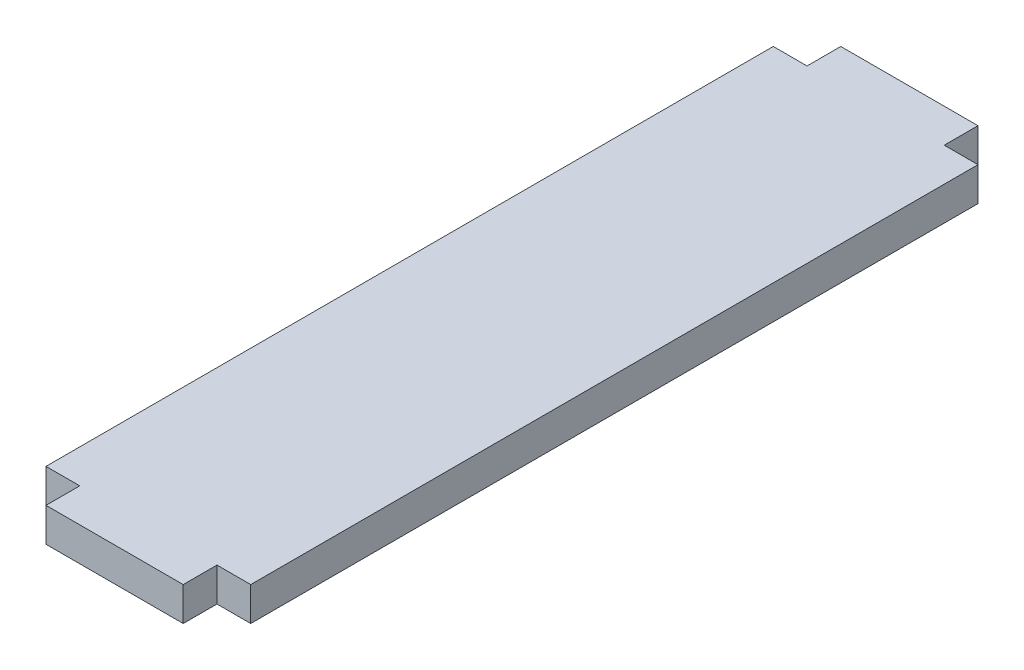
ISO-10303-21;
HEADER;
FILE_DESCRIPTION(('STEP AP214'),'2;1');
FILE_NAME('part.step','',(''),(''),'','','');
FILE_SCHEMA(('AUTOMOTIVE_DESIGN { 1 0 10303 214 1 1 1 1 }'));
ENDSEC;
DATA;
#1=APPLICATION_CONTEXT('core data for automotive mechanical design processes');
#2=APPLICATION_PROTOCOL_DEFINITION('international standard','automotive_design',2000,#1);
#3=PRODUCT_CONTEXT('',#1,'mechanical');
#4=PRODUCT('Part','Part','',(#3));
#5=PRODUCT_RELATED_PRODUCT_CATEGORY('part','',(#4));
#6=PRODUCT_DEFINITION_FORMATION('','',#4);
#7=PRODUCT_DEFINITION_CONTEXT('part definition',#1,'design');
#8=PRODUCT_DEFINITION('design','',#6,#7);
#9=PRODUCT_DEFINITION_SHAPE('','',#8);
#10=(LENGTH_UNIT() NAMED_UNIT(*) SI_UNIT(.MILLI.,.METRE.));
#11=(NAMED_UNIT(*) PLANE_ANGLE_UNIT() SI_UNIT($,.RADIAN.));
#12=(NAMED_UNIT(*) SI_UNIT($,.STERADIAN.) SOLID_ANGLE_UNIT());
#13=UNCERTAINTY_MEASURE_WITH_UNIT(LENGTH_MEASURE(1.E-05),#10,'distance_accuracy_value','');
#14=(GEOMETRIC_REPRESENTATION_CONTEXT(3) GLOBAL_UNCERTAINTY_ASSIGNED_CONTEXT((#13)) GLOBAL_UNIT_ASSIGNED_CONTEXT((#10,
#11,#12)) REPRESENTATION_CONTEXT('',''));
#15=CARTESIAN_POINT('',(0.,0.,0.));
#16=DIRECTION('',(0.,0.,1.));
#17=DIRECTION('',(1.,0.,0.));
#18=AXIS2_PLACEMENT_3D('',#15,#16,#17);
#19=CARTESIAN_POINT('',(-60.2742,3.1242,-61.5442));
#20=DIRECTION('',(0.,0.,-1.));
#21=DIRECTION('',(-1.,0.,0.));
#22=AXIS2_PLACEMENT_3D('',#19,#20,#21);
#23=PLANE('',#22);
#24=DIRECTION('',(1.,0.,0.));
#25=VECTOR('',#24,1.);
#26=CARTESIAN_POINT('',(-60.2742,0.,-61.5442));
#27=LINE('',#26,#25);
#28=CARTESIAN_POINT('',(-60.2742,0.,-61.5442));
#29=VERTEX_POINT('',#28);
#30=CARTESIAN_POINT('',(-57.15,0.,-61.5442));
#31=VERTEX_POINT('',#30);
#32=EDGE_CURVE('E153',#29,#31,#27,.T.);
#33=ORIENTED_EDGE('',*,*,#32,.T.);
#34=DIRECTION('',(0.,-1.,0.));
#35=VECTOR('',#34,1.);
#36=CARTESIAN_POINT('',(-57.15,3.1242,-61.5442));
#37=LINE('',#36,#35);
#38=CARTESIAN_POINT('',(-57.15,3.1242,-61.5442));
#39=VERTEX_POINT('',#38);
#40=EDGE_CURVE('E11',#39,#31,#37,.T.);
#41=ORIENTED_EDGE('',*,*,#40,.F.);
#42=DIRECTION('',(1.,0.,0.));
#43=VECTOR('',#42,1.);
#44=CARTESIAN_POINT('',(-60.2742,3.1242,-61.5442));
#45=LINE('',#44,#43);
#46=CARTESIAN_POINT('',(-60.2742,3.1242,-61.5442));
#47=VERTEX_POINT('',#46);
#48=EDGE_CURVE('E175',#47,#39,#45,.T.);
#49=ORIENTED_EDGE('',*,*,#48,.F.);
#50=DIRECTION('',(0.,-1.,0.));
#51=VECTOR('',#50,1.);
#52=CARTESIAN_POINT('',(-60.2742,3.1242,-61.5442));
#53=LINE('',#52,#51);
#54=EDGE_CURVE('E149',#47,#29,#53,.T.);
#55=ORIENTED_EDGE('',*,*,#54,.T.);
#56=EDGE_LOOP('',(#33,#41,#49,#55));
#57=FACE_BOUND('',#56,.T.);
#58=ADVANCED_FACE('F33',(#57),#23,.F.);
#59=CARTESIAN_POINT('',(-57.15,3.1242,-61.5442));
#60=DIRECTION('',(1.,0.,0.));
#61=DIRECTION('',(0.,0.,-1.));
#62=AXIS2_PLACEMENT_3D('',#59,#60,#61);
#63=PLANE('',#62);
#64=DIRECTION('',(0.,0.,1.));
#65=VECTOR('',#64,1.);
#66=CARTESIAN_POINT('',(-57.15,0.,-61.5442));
#67=LINE('',#66,#65);
#68=CARTESIAN_POINT('',(-57.15,0.,-58.42));
#69=VERTEX_POINT('',#68);
#70=EDGE_CURVE('E156',#31,#69,#67,.T.);
#71=ORIENTED_EDGE('',*,*,#70,.T.);
#72=DIRECTION('',(0.,-1.,0.));
#73=VECTOR('',#72,1.);
#74=CARTESIAN_POINT('',(-57.15,3.1242,-58.42));
#75=LINE('',#74,#73);
#76=CARTESIAN_POINT('',(-57.15,3.1242,-58.42));
#77=VERTEX_POINT('',#76);
#78=EDGE_CURVE('E41',#77,#69,#75,.T.);
#79=ORIENTED_EDGE('',*,*,#78,.F.);
#80=DIRECTION('',(0.,0.,1.));
#81=VECTOR('',#80,1.);
#82=CARTESIAN_POINT('',(-57.15,3.1242,-61.5442));
#83=LINE('',#82,#81);
#84=EDGE_CURVE('E104',#39,#77,#83,.T.);
#85=ORIENTED_EDGE('',*,*,#84,.F.);
#86=ORIENTED_EDGE('',*,*,#40,.T.);
#87=EDGE_LOOP('',(#71,#79,#85,#86));
#88=FACE_BOUND('',#87,.T.);
#89=ADVANCED_FACE('F253',(#88),#63,.F.);
#90=CARTESIAN_POINT('',(-57.15,3.1242,-58.42));
#91=DIRECTION('',(0.,0.,-1.));
#92=DIRECTION('',(-1.,0.,0.));
#93=AXIS2_PLACEMENT_3D('',#90,#91,#92);
#94=PLANE('',#93);
#95=DIRECTION('',(1.,0.,0.));
#96=VECTOR('',#95,1.);
#97=CARTESIAN_POINT('',(-57.15,0.,-58.42));
#98=LINE('',#97,#96);
#99=CARTESIAN_POINT('',(-44.45,0.,-58.42));
#100=VERTEX_POINT('',#99);
#101=EDGE_CURVE('E158',#69,#100,#98,.T.);
#102=ORIENTED_EDGE('',*,*,#101,.T.);
#103=DIRECTION('',(0.,-1.,0.));
#104=VECTOR('',#103,1.);
#105=CARTESIAN_POINT('',(-44.45,3.1242,-58.42));
#106=LINE('',#105,#104);
#107=CARTESIAN_POINT('',(-44.45,3.1242,-58.42));
#108=VERTEX_POINT('',#107);
#109=EDGE_CURVE('E194',#108,#100,#106,.T.);
#110=ORIENTED_EDGE('',*,*,#109,.F.);
#111=DIRECTION('',(1.,0.,0.));
#112=VECTOR('',#111,1.);
#113=CARTESIAN_POINT('',(-57.15,3.1242,-58.42));
#114=LINE('',#113,#112);
#115=EDGE_CURVE('E202',#77,#108,#114,.T.);
#116=ORIENTED_EDGE('',*,*,#115,.F.);
#117=ORIENTED_EDGE('',*,*,#78,.T.);
#118=EDGE_LOOP('',(#102,#110,#116,#117));
#119=FACE_BOUND('',#118,.T.);
#120=ADVANCED_FACE('F200',(#119),#94,.F.);
#121=CARTESIAN_POINT('',(-44.45,3.1242,-58.42));
#122=DIRECTION('',(-1.,0.,0.));
#123=DIRECTION('',(0.,0.,1.));
#124=AXIS2_PLACEMENT_3D('',#121,#122,#123);
#125=PLANE('',#124);
#126=DIRECTION('',(0.,0.,-1.));
#127=VECTOR('',#126,1.);
#128=CARTESIAN_POINT('',(-44.45,0.,-58.42));
#129=LINE('',#128,#127);
#130=CARTESIAN_POINT('',(-44.45,0.,-61.5442));
#131=VERTEX_POINT('',#130);
#132=EDGE_CURVE('E160',#100,#131,#129,.T.);
#133=ORIENTED_EDGE('',*,*,#132,.T.);
#134=DIRECTION('',(0.,-1.,0.));
#135=VECTOR('',#134,1.);
#136=CARTESIAN_POINT('',(-44.45,3.1242,-61.5442));
#137=LINE('',#136,#135);
#138=CARTESIAN_POINT('',(-44.45,3.1242,-61.5442));
#139=VERTEX_POINT('',#138);
#140=EDGE_CURVE('E191',#139,#131,#137,.T.);
#141=ORIENTED_EDGE('',*,*,#140,.F.);
#142=DIRECTION('',(0.,0.,-1.));
#143=VECTOR('',#142,1.);
#144=CARTESIAN_POINT('',(-44.45,3.1242,-58.42));
#145=LINE('',#144,#143);
#146=EDGE_CURVE('E220',#108,#139,#145,.T.);
#147=ORIENTED_EDGE('',*,*,#146,.F.);
#148=ORIENTED_EDGE('',*,*,#109,.T.);
#149=EDGE_LOOP('',(#133,#141,#147,#148));
#150=FACE_BOUND('',#149,.T.);
#151=ADVANCED_FACE('F211',(#150),#125,.F.);
#152=CARTESIAN_POINT('',(-44.45,3.1242,-61.5442));
#153=DIRECTION('',(0.,0.,-1.));
#154=DIRECTION('',(-1.,0.,0.));
#155=AXIS2_PLACEMENT_3D('',#152,#153,#154);
#156=PLANE('',#155);
#157=DIRECTION('',(1.,0.,0.));
#158=VECTOR('',#157,1.);
#159=CARTESIAN_POINT('',(-44.45,0.,-61.5442));
#160=LINE('',#159,#158);
#161=CARTESIAN_POINT('',(-41.3258000000001,0.,-61.5442));
#162=VERTEX_POINT('',#161);
#163=EDGE_CURVE('E162',#131,#162,#160,.T.);
#164=ORIENTED_EDGE('',*,*,#163,.T.);
#165=DIRECTION('',(0.,-1.,0.));
#166=VECTOR('',#165,1.);
#167=CARTESIAN_POINT('',(-41.3258000000001,3.1242,-61.5442));
#168=LINE('',#167,#166);
#169=CARTESIAN_POINT('',(-41.3258000000001,3.1242,-61.5442));
#170=VERTEX_POINT('',#169);
#171=EDGE_CURVE('E188',#170,#162,#168,.T.);
#172=ORIENTED_EDGE('',*,*,#171,.F.);
#173=DIRECTION('',(1.,0.,0.));
#174=VECTOR('',#173,1.);
#175=CARTESIAN_POINT('',(-44.45,3.1242,-61.5442));
#176=LINE('',#175,#174);
#177=EDGE_CURVE('E217',#139,#170,#176,.T.);
#178=ORIENTED_EDGE('',*,*,#177,.F.);
#179=ORIENTED_EDGE('',*,*,#140,.T.);
#180=EDGE_LOOP('',(#164,#172,#178,#179));
#181=FACE_BOUND('',#180,.T.);
#182=ADVANCED_FACE('F215',(#181),#156,.F.);
#183=CARTESIAN_POINT('',(-41.3258000000001,3.1242,-61.5442));
#184=DIRECTION('',(-1.,0.,0.));
#185=DIRECTION('',(0.,0.,1.));
#186=AXIS2_PLACEMENT_3D('',#183,#184,#185);
#187=PLANE('',#186);
#188=DIRECTION('',(0.,0.,-1.));
#189=VECTOR('',#188,1.);
#190=CARTESIAN_POINT('',(-41.3258000000001,0.,-61.5442));
#191=LINE('',#190,#189);
#192=CARTESIAN_POINT('',(-41.3258000000001,0.,-128.8542));
#193=VERTEX_POINT('',#192);
#194=EDGE_CURVE('E164',#162,#193,#191,.T.);
#195=ORIENTED_EDGE('',*,*,#194,.T.);
#196=DIRECTION('',(0.,-1.,0.));
#197=VECTOR('',#196,1.);
#198=CARTESIAN_POINT('',(-41.3258000000001,3.1242,-128.8542));
#199=LINE('',#198,#197);
#200=CARTESIAN_POINT('',(-41.3258000000001,3.1242,-128.8542));
#201=VERTEX_POINT('',#200);
#202=EDGE_CURVE('E185',#201,#193,#199,.T.);
#203=ORIENTED_EDGE('',*,*,#202,.F.);
#204=DIRECTION('',(0.,0.,-1.));
#205=VECTOR('',#204,1.);
#206=CARTESIAN_POINT('',(-41.3258000000001,3.1242,-61.5442));
#207=LINE('',#206,#205);
#208=EDGE_CURVE('E219',#170,#201,#207,.T.);
#209=ORIENTED_EDGE('',*,*,#208,.F.);
#210=ORIENTED_EDGE('',*,*,#171,.T.);
#211=EDGE_LOOP('',(#195,#203,#209,#210));
#212=FACE_BOUND('',#211,.T.);
#213=ADVANCED_FACE('F266',(#212),#187,.F.);
#214=CARTESIAN_POINT('',(-41.3258000000001,3.1242,-128.8542));
#215=DIRECTION('',(0.,0.,1.));
#216=DIRECTION('',(1.,0.,0.));
#217=AXIS2_PLACEMENT_3D('',#214,#215,#216);
#218=PLANE('',#217);
#219=DIRECTION('',(-1.,0.,0.));
#220=VECTOR('',#219,1.);
#221=CARTESIAN_POINT('',(-41.3258000000001,0.,-128.8542));
#222=LINE('',#221,#220);
#223=CARTESIAN_POINT('',(-44.45,0.,-128.8542));
#224=VERTEX_POINT('',#223);
#225=EDGE_CURVE('E166',#193,#224,#222,.T.);
#226=ORIENTED_EDGE('',*,*,#225,.T.);
#227=DIRECTION('',(0.,-1.,0.));
#228=VECTOR('',#227,1.);
#229=CARTESIAN_POINT('',(-44.45,3.1242,-128.8542));
#230=LINE('',#229,#228);
#231=CARTESIAN_POINT('',(-44.45,3.1242,-128.8542));
#232=VERTEX_POINT('',#231);
#233=EDGE_CURVE('E182',#232,#224,#230,.T.);
#234=ORIENTED_EDGE('',*,*,#233,.F.);
#235=DIRECTION('',(-1.,0.,0.));
#236=VECTOR('',#235,1.);
#237=CARTESIAN_POINT('',(-41.3258000000001,3.1242,-128.8542));
#238=LINE('',#237,#236);
#239=EDGE_CURVE('E222',#201,#232,#238,.T.);
#240=ORIENTED_EDGE('',*,*,#239,.F.);
#241=ORIENTED_EDGE('',*,*,#202,.T.);
#242=EDGE_LOOP('',(#226,#234,#240,#241));
#243=FACE_BOUND('',#242,.T.);
#244=ADVANCED_FACE('F269',(#243),#218,.F.);
#245=CARTESIAN_POINT('',(-44.45,3.1242,-128.8542));
#246=DIRECTION('',(-1.,0.,0.));
#247=DIRECTION('',(0.,0.,1.));
#248=AXIS2_PLACEMENT_3D('',#245,#246,#247);
#249=PLANE('',#248);
#250=DIRECTION('',(0.,0.,-1.));
#251=VECTOR('',#250,1.);
#252=CARTESIAN_POINT('',(-44.45,0.,-128.8542));
#253=LINE('',#252,#251);
#254=CARTESIAN_POINT('',(-44.45,0.,-131.9784));
#255=VERTEX_POINT('',#254);
#256=EDGE_CURVE('E168',#224,#255,#253,.T.);
#257=ORIENTED_EDGE('',*,*,#256,.T.);
#258=DIRECTION('',(0.,-1.,0.));
#259=VECTOR('',#258,1.);
#260=CARTESIAN_POINT('',(-44.45,3.1242,-131.9784));
#261=LINE('',#260,#259);
#262=CARTESIAN_POINT('',(-44.45,3.1242,-131.9784));
#263=VERTEX_POINT('',#262);
#264=EDGE_CURVE('E179',#263,#255,#261,.T.);
#265=ORIENTED_EDGE('',*,*,#264,.F.);
#266=DIRECTION('',(0.,0.,-1.));
#267=VECTOR('',#266,1.);
#268=CARTESIAN_POINT('',(-44.45,3.1242,-128.8542));
#269=LINE('',#268,#267);
#270=EDGE_CURVE('E228',#232,#263,#269,.T.);
#271=ORIENTED_EDGE('',*,*,#270,.F.);
#272=ORIENTED_EDGE('',*,*,#233,.T.);
#273=EDGE_LOOP('',(#257,#265,#271,#272));
#274=FACE_BOUND('',#273,.T.);
#275=ADVANCED_FACE('F234',(#274),#249,.F.);
#276=CARTESIAN_POINT('',(-44.45,3.1242,-131.9784));
#277=DIRECTION('',(0.,0.,1.));
#278=DIRECTION('',(1.,0.,0.));
#279=AXIS2_PLACEMENT_3D('',#276,#277,#278);
#280=PLANE('',#279);
#281=DIRECTION('',(-1.,0.,0.));
#282=VECTOR('',#281,1.);
#283=CARTESIAN_POINT('',(-44.45,0.,-131.9784));
#284=LINE('',#283,#282);
#285=CARTESIAN_POINT('',(-57.15,0.,-131.9784));
#286=VERTEX_POINT('',#285);
#287=EDGE_CURVE('E170',#255,#286,#284,.T.);
#288=ORIENTED_EDGE('',*,*,#287,.T.);
#289=DIRECTION('',(0.,-1.,0.));
#290=VECTOR('',#289,1.);
#291=CARTESIAN_POINT('',(-57.15,3.1242,-131.9784));
#292=LINE('',#291,#290);
#293=CARTESIAN_POINT('',(-57.15,3.1242,-131.9784));
#294=VERTEX_POINT('',#293);
#295=EDGE_CURVE('E144',#294,#286,#292,.T.);
#296=ORIENTED_EDGE('',*,*,#295,.F.);
#297=DIRECTION('',(-1.,0.,0.));
#298=VECTOR('',#297,1.);
#299=CARTESIAN_POINT('',(-44.45,3.1242,-131.9784));
#300=LINE('',#299,#298);
#301=EDGE_CURVE('E135',#263,#294,#300,.T.);
#302=ORIENTED_EDGE('',*,*,#301,.F.);
#303=ORIENTED_EDGE('',*,*,#264,.T.);
#304=EDGE_LOOP('',(#288,#296,#302,#303));
#305=FACE_BOUND('',#304,.T.);
#306=ADVANCED_FACE('F238',(#305),#280,.F.);
#307=CARTESIAN_POINT('',(-57.15,3.1242,-131.9784));
#308=DIRECTION('',(1.,0.,0.));
#309=DIRECTION('',(0.,0.,-1.));
#310=AXIS2_PLACEMENT_3D('',#307,#308,#309);
#311=PLANE('',#310);
#312=DIRECTION('',(0.,0.,1.));
#313=VECTOR('',#312,1.);
#314=CARTESIAN_POINT('',(-57.15,0.,-131.9784));
#315=LINE('',#314,#313);
#316=CARTESIAN_POINT('',(-57.15,0.,-128.8542));
#317=VERTEX_POINT('',#316);
#318=EDGE_CURVE('E143',#286,#317,#315,.T.);
#319=ORIENTED_EDGE('',*,*,#318,.T.);
#320=DIRECTION('',(0.,-1.,0.));
#321=VECTOR('',#320,1.);
#322=CARTESIAN_POINT('',(-57.15,3.1242,-128.8542));
#323=LINE('',#322,#321);
#324=CARTESIAN_POINT('',(-57.15,3.1242,-128.8542));
#325=VERTEX_POINT('',#324);
#326=EDGE_CURVE('E140',#325,#317,#323,.T.);
#327=ORIENTED_EDGE('',*,*,#326,.F.);
#328=DIRECTION('',(0.,0.,1.));
#329=VECTOR('',#328,1.);
#330=CARTESIAN_POINT('',(-57.15,3.1242,-131.9784));
#331=LINE('',#330,#329);
#332=EDGE_CURVE('E129',#294,#325,#331,.T.);
#333=ORIENTED_EDGE('',*,*,#332,.F.);
#334=ORIENTED_EDGE('',*,*,#295,.T.);
#335=EDGE_LOOP('',(#319,#327,#333,#334));
#336=FACE_BOUND('',#335,.T.);
#337=ADVANCED_FACE('F141',(#336),#311,.F.);
#338=CARTESIAN_POINT('',(-57.15,3.1242,-128.8542));
#339=DIRECTION('',(0.,0.,1.));
#340=DIRECTION('',(1.,0.,0.));
#341=AXIS2_PLACEMENT_3D('',#338,#339,#340);
#342=PLANE('',#341);
#343=DIRECTION('',(-1.,0.,0.));
#344=VECTOR('',#343,1.);
#345=CARTESIAN_POINT('',(-57.15,0.,-128.8542));
#346=LINE('',#345,#344);
#347=CARTESIAN_POINT('',(-60.2742,0.,-128.8542));
#348=VERTEX_POINT('',#347);
#349=EDGE_CURVE('E90',#317,#348,#346,.T.);
#350=ORIENTED_EDGE('',*,*,#349,.T.);
#351=DIRECTION('',(0.,-1.,0.));
#352=VECTOR('',#351,1.);
#353=CARTESIAN_POINT('',(-60.2742,3.1242,-128.8542));
#354=LINE('',#353,#352);
#355=CARTESIAN_POINT('',(-60.2742,3.1242,-128.8542));
#356=VERTEX_POINT('',#355);
#357=EDGE_CURVE('E145',#356,#348,#354,.T.);
#358=ORIENTED_EDGE('',*,*,#357,.F.);
#359=DIRECTION('',(-1.,0.,0.));
#360=VECTOR('',#359,1.);
#361=CARTESIAN_POINT('',(-57.15,3.1242,-128.8542));
#362=LINE('',#361,#360);
#363=EDGE_CURVE('E133',#325,#356,#362,.T.);
#364=ORIENTED_EDGE('',*,*,#363,.F.);
#365=ORIENTED_EDGE('',*,*,#326,.T.);
#366=EDGE_LOOP('',(#350,#358,#364,#365));
#367=FACE_BOUND('',#366,.T.);
#368=ADVANCED_FACE('F147',(#367),#342,.F.);
#369=CARTESIAN_POINT('',(-60.2742,3.1242,-128.8542));
#370=DIRECTION('',(1.,0.,0.));
#371=DIRECTION('',(0.,0.,-1.));
#372=AXIS2_PLACEMENT_3D('',#369,#370,#371);
#373=PLANE('',#372);
#374=DIRECTION('',(0.,0.,1.));
#375=VECTOR('',#374,1.);
#376=CARTESIAN_POINT('',(-60.2742,0.,-128.8542));
#377=LINE('',#376,#375);
#378=EDGE_CURVE('E96',#348,#29,#377,.T.);
#379=ORIENTED_EDGE('',*,*,#378,.T.);
#380=ORIENTED_EDGE('',*,*,#54,.F.);
#381=DIRECTION('',(0.,0.,1.));
#382=VECTOR('',#381,1.);
#383=CARTESIAN_POINT('',(-60.2742,3.1242,-128.8542));
#384=LINE('',#383,#382);
#385=EDGE_CURVE('E49',#356,#47,#384,.T.);
#386=ORIENTED_EDGE('',*,*,#385,.F.);
#387=ORIENTED_EDGE('',*,*,#357,.T.);
#388=EDGE_LOOP('',(#379,#380,#386,#387));
#389=FACE_BOUND('',#388,.T.);
#390=ADVANCED_FACE('F242',(#389),#373,.F.);
#391=CARTESIAN_POINT('',(0.,3.1242,0.));
#392=DIRECTION('',(0.,-1.,0.));
#393=DIRECTION('',(0.,0.,-1.));
#394=AXIS2_PLACEMENT_3D('',#391,#392,#393);
#395=PLANE('',#394);
#396=ORIENTED_EDGE('',*,*,#48,.T.);
#397=ORIENTED_EDGE('',*,*,#84,.T.);
#398=ORIENTED_EDGE('',*,*,#115,.T.);
#399=ORIENTED_EDGE('',*,*,#146,.T.);
#400=ORIENTED_EDGE('',*,*,#177,.T.);
#401=ORIENTED_EDGE('',*,*,#208,.T.);
#402=ORIENTED_EDGE('',*,*,#239,.T.);
#403=ORIENTED_EDGE('',*,*,#270,.T.);
#404=ORIENTED_EDGE('',*,*,#301,.T.);
#405=ORIENTED_EDGE('',*,*,#332,.T.);
#406=ORIENTED_EDGE('',*,*,#363,.T.);
#407=ORIENTED_EDGE('',*,*,#385,.T.);
#408=EDGE_LOOP('',(#396,#397,#398,#399,#400,#401,#402,#403,#404,#405,#406,#407));
#409=FACE_BOUND('',#408,.T.);
#410=ADVANCED_FACE('F131',(#409),#395,.F.);
#411=CARTESIAN_POINT('',(0.,0.,0.));
#412=DIRECTION('',(0.,-1.,0.));
#413=DIRECTION('',(0.,0.,-1.));
#414=AXIS2_PLACEMENT_3D('',#411,#412,#413);
#415=PLANE('',#414);
#416=ORIENTED_EDGE('',*,*,#32,.F.);
#417=ORIENTED_EDGE('',*,*,#378,.F.);
#418=ORIENTED_EDGE('',*,*,#349,.F.);
#419=ORIENTED_EDGE('',*,*,#318,.F.);
#420=ORIENTED_EDGE('',*,*,#287,.F.);
#421=ORIENTED_EDGE('',*,*,#256,.F.);
#422=ORIENTED_EDGE('',*,*,#225,.F.);
#423=ORIENTED_EDGE('',*,*,#194,.F.);
#424=ORIENTED_EDGE('',*,*,#163,.F.);
#425=ORIENTED_EDGE('',*,*,#132,.F.);
#426=ORIENTED_EDGE('',*,*,#101,.F.);
#427=ORIENTED_EDGE('',*,*,#70,.F.);
#428=EDGE_LOOP('',(#416,#417,#418,#419,#420,#421,#422,#423,#424,#425,#426,#427));
#429=FACE_BOUND('',#428,.T.);
#430=ADVANCED_FACE('F206',(#429),#415,.T.);
#431=CLOSED_SHELL('',(#58,#89,#120,#151,#182,#213,#244,#275,#306,#337,#368,#390,#410,#430));
#432=MANIFOLD_SOLID_BREP('B2',#431);
#433=ADVANCED_BREP_SHAPE_REPRESENTATION('',(#18,#432),#14);
#434=SHAPE_DEFINITION_REPRESENTATION(#9,#433);
ENDSEC;
END-ISO-10303-21;
